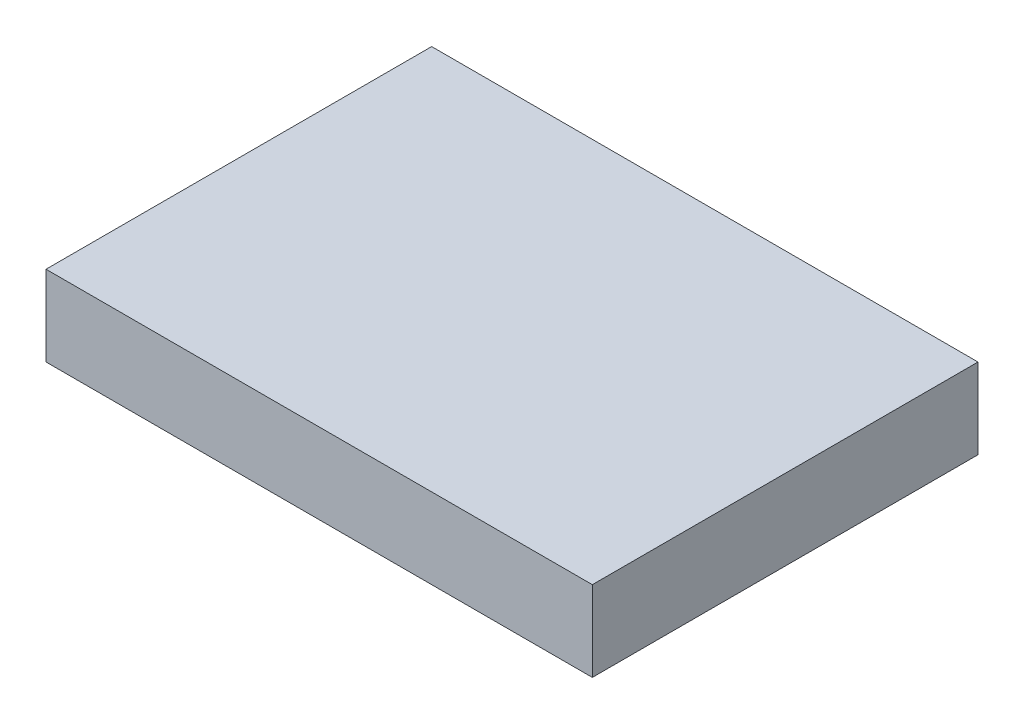
ISO-10303-21;
HEADER;
FILE_DESCRIPTION(('STEP AP214'),'2;1');
FILE_NAME('part.step','',(''),(''),'','','');
FILE_SCHEMA(('AUTOMOTIVE_DESIGN { 1 0 10303 214 1 1 1 1 }'));
ENDSEC;
DATA;
#1=APPLICATION_CONTEXT('core data for automotive mechanical design processes');
#2=APPLICATION_PROTOCOL_DEFINITION('international standard','automotive_design',2000,#1);
#3=PRODUCT_CONTEXT('',#1,'mechanical');
#4=PRODUCT('Part','Part','',(#3));
#5=PRODUCT_RELATED_PRODUCT_CATEGORY('part','',(#4));
#6=PRODUCT_DEFINITION_FORMATION('','',#4);
#7=PRODUCT_DEFINITION_CONTEXT('part definition',#1,'design');
#8=PRODUCT_DEFINITION('design','',#6,#7);
#9=PRODUCT_DEFINITION_SHAPE('','',#8);
#10=(LENGTH_UNIT() NAMED_UNIT(*) SI_UNIT(.MILLI.,.METRE.));
#11=(NAMED_UNIT(*) PLANE_ANGLE_UNIT() SI_UNIT($,.RADIAN.));
#12=(NAMED_UNIT(*) SI_UNIT($,.STERADIAN.) SOLID_ANGLE_UNIT());
#13=UNCERTAINTY_MEASURE_WITH_UNIT(LENGTH_MEASURE(1.E-05),#10,'distance_accuracy_value','');
#14=(GEOMETRIC_REPRESENTATION_CONTEXT(3) GLOBAL_UNCERTAINTY_ASSIGNED_CONTEXT((#13)) GLOBAL_UNIT_ASSIGNED_CONTEXT((#10,
#11,#12)) REPRESENTATION_CONTEXT('',''));
#15=CARTESIAN_POINT('',(0.,0.,0.));
#16=DIRECTION('',(0.,0.,1.));
#17=DIRECTION('',(1.,0.,0.));
#18=AXIS2_PLACEMENT_3D('',#15,#16,#17);
#19=CARTESIAN_POINT('',(17.,5.,12.));
#20=DIRECTION('',(-1.,0.,0.));
#21=DIRECTION('',(0.,0.,1.));
#22=AXIS2_PLACEMENT_3D('',#19,#20,#21);
#23=PLANE('',#22);
#24=DIRECTION('',(0.,0.,-1.));
#25=VECTOR('',#24,1.);
#26=CARTESIAN_POINT('',(17.,0.,12.));
#27=LINE('',#26,#25);
#28=CARTESIAN_POINT('',(17.,0.,12.));
#29=VERTEX_POINT('',#28);
#30=CARTESIAN_POINT('',(17.,0.,-12.));
#31=VERTEX_POINT('',#30);
#32=EDGE_CURVE('E96',#29,#31,#27,.T.);
#33=ORIENTED_EDGE('',*,*,#32,.T.);
#34=DIRECTION('',(0.,-1.,0.));
#35=VECTOR('',#34,1.);
#36=CARTESIAN_POINT('',(17.,5.,-12.));
#37=LINE('',#36,#35);
#38=CARTESIAN_POINT('',(17.,5.,-12.));
#39=VERTEX_POINT('',#38);
#40=EDGE_CURVE('E11',#39,#31,#37,.T.);
#41=ORIENTED_EDGE('',*,*,#40,.F.);
#42=DIRECTION('',(0.,0.,-1.));
#43=VECTOR('',#42,1.);
#44=CARTESIAN_POINT('',(17.,5.,12.));
#45=LINE('',#44,#43);
#46=CARTESIAN_POINT('',(17.,5.,12.));
#47=VERTEX_POINT('',#46);
#48=EDGE_CURVE('E84',#47,#39,#45,.T.);
#49=ORIENTED_EDGE('',*,*,#48,.F.);
#50=DIRECTION('',(0.,-1.,0.));
#51=VECTOR('',#50,1.);
#52=CARTESIAN_POINT('',(17.,5.,12.));
#53=LINE('',#52,#51);
#54=EDGE_CURVE('E92',#47,#29,#53,.T.);
#55=ORIENTED_EDGE('',*,*,#54,.T.);
#56=EDGE_LOOP('',(#33,#41,#49,#55));
#57=FACE_BOUND('',#56,.T.);
#58=ADVANCED_FACE('F33',(#57),#23,.F.);
#59=CARTESIAN_POINT('',(-17.,5.,-12.));
#60=DIRECTION('',(0.,0.,1.));
#61=DIRECTION('',(1.,0.,0.));
#62=AXIS2_PLACEMENT_3D('',#59,#60,#61);
#63=PLANE('',#62);
#64=DIRECTION('',(-1.,0.,0.));
#65=VECTOR('',#64,1.);
#66=CARTESIAN_POINT('',(-17.,0.,-12.));
#67=LINE('',#66,#65);
#68=CARTESIAN_POINT('',(-17.,0.,-12.));
#69=VERTEX_POINT('',#68);
#70=EDGE_CURVE('E88',#31,#69,#67,.T.);
#71=ORIENTED_EDGE('',*,*,#70,.T.);
#72=DIRECTION('',(0.,-1.,0.));
#73=VECTOR('',#72,1.);
#74=CARTESIAN_POINT('',(-17.,5.,-12.));
#75=LINE('',#74,#73);
#76=CARTESIAN_POINT('',(-17.,5.,-12.));
#77=VERTEX_POINT('',#76);
#78=EDGE_CURVE('E41',#77,#69,#75,.T.);
#79=ORIENTED_EDGE('',*,*,#78,.F.);
#80=DIRECTION('',(-1.,0.,0.));
#81=VECTOR('',#80,1.);
#82=CARTESIAN_POINT('',(-17.,5.,-12.));
#83=LINE('',#82,#81);
#84=EDGE_CURVE('E79',#39,#77,#83,.T.);
#85=ORIENTED_EDGE('',*,*,#84,.F.);
#86=ORIENTED_EDGE('',*,*,#40,.T.);
#87=EDGE_LOOP('',(#71,#79,#85,#86));
#88=FACE_BOUND('',#87,.T.);
#89=ADVANCED_FACE('F87',(#88),#63,.F.);
#90=CARTESIAN_POINT('',(-17.,5.,12.));
#91=DIRECTION('',(1.,0.,0.));
#92=DIRECTION('',(0.,0.,-1.));
#93=AXIS2_PLACEMENT_3D('',#90,#91,#92);
#94=PLANE('',#93);
#95=DIRECTION('',(0.,0.,1.));
#96=VECTOR('',#95,1.);
#97=CARTESIAN_POINT('',(-17.,0.,12.));
#98=LINE('',#97,#96);
#99=CARTESIAN_POINT('',(-17.,0.,12.));
#100=VERTEX_POINT('',#99);
#101=EDGE_CURVE('E66',#69,#100,#98,.T.);
#102=ORIENTED_EDGE('',*,*,#101,.T.);
#103=DIRECTION('',(0.,-1.,0.));
#104=VECTOR('',#103,1.);
#105=CARTESIAN_POINT('',(-17.,5.,12.));
#106=LINE('',#105,#104);
#107=CARTESIAN_POINT('',(-17.,5.,12.));
#108=VERTEX_POINT('',#107);
#109=EDGE_CURVE('E89',#108,#100,#106,.T.);
#110=ORIENTED_EDGE('',*,*,#109,.F.);
#111=DIRECTION('',(0.,0.,1.));
#112=VECTOR('',#111,1.);
#113=CARTESIAN_POINT('',(-17.,5.,12.));
#114=LINE('',#113,#112);
#115=EDGE_CURVE('E82',#77,#108,#114,.T.);
#116=ORIENTED_EDGE('',*,*,#115,.F.);
#117=ORIENTED_EDGE('',*,*,#78,.T.);
#118=EDGE_LOOP('',(#102,#110,#116,#117));
#119=FACE_BOUND('',#118,.T.);
#120=ADVANCED_FACE('F90',(#119),#94,.F.);
#121=CARTESIAN_POINT('',(-17.,5.,12.));
#122=DIRECTION('',(0.,0.,-1.));
#123=DIRECTION('',(-1.,0.,0.));
#124=AXIS2_PLACEMENT_3D('',#121,#122,#123);
#125=PLANE('',#124);
#126=DIRECTION('',(1.,0.,0.));
#127=VECTOR('',#126,1.);
#128=CARTESIAN_POINT('',(-17.,0.,12.));
#129=LINE('',#128,#127);
#130=EDGE_CURVE('E72',#100,#29,#129,.T.);
#131=ORIENTED_EDGE('',*,*,#130,.T.);
#132=ORIENTED_EDGE('',*,*,#54,.F.);
#133=DIRECTION('',(1.,0.,0.));
#134=VECTOR('',#133,1.);
#135=CARTESIAN_POINT('',(-17.,5.,12.));
#136=LINE('',#135,#134);
#137=EDGE_CURVE('E49',#108,#47,#136,.T.);
#138=ORIENTED_EDGE('',*,*,#137,.F.);
#139=ORIENTED_EDGE('',*,*,#109,.T.);
#140=EDGE_LOOP('',(#131,#132,#138,#139));
#141=FACE_BOUND('',#140,.T.);
#142=ADVANCED_FACE('F103',(#141),#125,.F.);
#143=CARTESIAN_POINT('',(0.,5.,0.));
#144=DIRECTION('',(0.,-1.,0.));
#145=DIRECTION('',(0.,0.,-1.));
#146=AXIS2_PLACEMENT_3D('',#143,#144,#145);
#147=PLANE('',#146);
#148=ORIENTED_EDGE('',*,*,#48,.T.);
#149=ORIENTED_EDGE('',*,*,#84,.T.);
#150=ORIENTED_EDGE('',*,*,#115,.T.);
#151=ORIENTED_EDGE('',*,*,#137,.T.);
#152=EDGE_LOOP('',(#148,#149,#150,#151));
#153=FACE_BOUND('',#152,.T.);
#154=ADVANCED_FACE('F80',(#153),#147,.F.);
#155=CARTESIAN_POINT('',(0.,0.,0.));
#156=DIRECTION('',(0.,-1.,0.));
#157=DIRECTION('',(0.,0.,-1.));
#158=AXIS2_PLACEMENT_3D('',#155,#156,#157);
#159=PLANE('',#158);
#160=ORIENTED_EDGE('',*,*,#32,.F.);
#161=ORIENTED_EDGE('',*,*,#130,.F.);
#162=ORIENTED_EDGE('',*,*,#101,.F.);
#163=ORIENTED_EDGE('',*,*,#70,.F.);
#164=EDGE_LOOP('',(#160,#161,#162,#163));
#165=FACE_BOUND('',#164,.T.);
#166=ADVANCED_FACE('F106',(#165),#159,.T.);
#167=CLOSED_SHELL('',(#58,#89,#120,#142,#154,#166));
#168=MANIFOLD_SOLID_BREP('B2',#167);
#169=ADVANCED_BREP_SHAPE_REPRESENTATION('',(#18,#168),#14);
#170=SHAPE_DEFINITION_REPRESENTATION(#9,#169);
ENDSEC;
END-ISO-10303-21;
